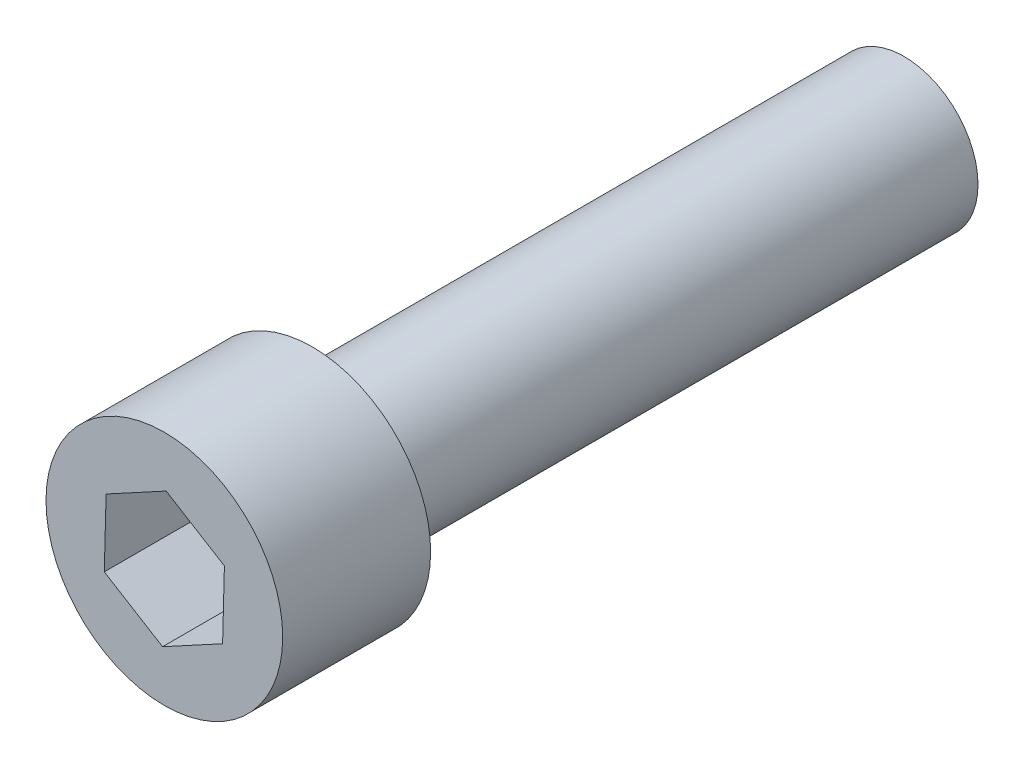
ISO-10303-21;
HEADER;
FILE_DESCRIPTION(('STEP AP214'),'2;1');
FILE_NAME('part.step','',(''),(''),'','','');
FILE_SCHEMA(('AUTOMOTIVE_DESIGN { 1 0 10303 214 1 1 1 1 }'));
ENDSEC;
DATA;
#1=APPLICATION_CONTEXT('core data for automotive mechanical design processes');
#2=APPLICATION_PROTOCOL_DEFINITION('international standard','automotive_design',2000,#1);
#3=PRODUCT_CONTEXT('',#1,'mechanical');
#4=PRODUCT('Part','Part','',(#3));
#5=PRODUCT_RELATED_PRODUCT_CATEGORY('part','',(#4));
#6=PRODUCT_DEFINITION_FORMATION('','',#4);
#7=PRODUCT_DEFINITION_CONTEXT('part definition',#1,'design');
#8=PRODUCT_DEFINITION('design','',#6,#7);
#9=PRODUCT_DEFINITION_SHAPE('','',#8);
#10=(LENGTH_UNIT() NAMED_UNIT(*) SI_UNIT(.MILLI.,.METRE.));
#11=(NAMED_UNIT(*) PLANE_ANGLE_UNIT() SI_UNIT($,.RADIAN.));
#12=(NAMED_UNIT(*) SI_UNIT($,.STERADIAN.) SOLID_ANGLE_UNIT());
#13=UNCERTAINTY_MEASURE_WITH_UNIT(LENGTH_MEASURE(1.E-05),#10,'distance_accuracy_value','');
#14=(GEOMETRIC_REPRESENTATION_CONTEXT(3) GLOBAL_UNCERTAINTY_ASSIGNED_CONTEXT((#13)) GLOBAL_UNIT_ASSIGNED_CONTEXT((#10,
#11,#12)) REPRESENTATION_CONTEXT('',''));
#15=CARTESIAN_POINT('',(0.,0.,0.));
#16=DIRECTION('',(0.,0.,1.));
#17=DIRECTION('',(1.,0.,0.));
#18=AXIS2_PLACEMENT_3D('',#15,#16,#17);
#19=CARTESIAN_POINT('',(0.,0.,20.));
#20=DIRECTION('',(0.,0.,-1.));
#21=DIRECTION('',(-1.,0.,0.));
#22=AXIS2_PLACEMENT_3D('',#19,#20,#21);
#23=CYLINDRICAL_SURFACE('',#22,2.5);
#24=CARTESIAN_POINT('',(0.,0.,20.));
#25=DIRECTION('',(0.,0.,1.));
#26=DIRECTION('',(1.,0.,0.));
#27=AXIS2_PLACEMENT_3D('',#24,#25,#26);
#28=CIRCLE('',#27,2.5);
#29=CARTESIAN_POINT('',(2.5,0.,20.));
#30=VERTEX_POINT('',#29);
#31=EDGE_CURVE('E11',#30,#30,#28,.T.);
#32=ORIENTED_EDGE('',*,*,#31,.F.);
#33=EDGE_LOOP('',(#32));
#34=FACE_BOUND('',#33,.T.);
#35=CARTESIAN_POINT('',(0.,0.,0.));
#36=DIRECTION('',(0.,0.,1.));
#37=DIRECTION('',(1.,0.,0.));
#38=AXIS2_PLACEMENT_3D('',#35,#36,#37);
#39=CIRCLE('',#38,2.5);
#40=CARTESIAN_POINT('',(2.5,0.,0.));
#41=VERTEX_POINT('',#40);
#42=EDGE_CURVE('E42',#41,#41,#39,.T.);
#43=ORIENTED_EDGE('',*,*,#42,.T.);
#44=EDGE_LOOP('',(#43));
#45=FACE_BOUND('',#44,.T.);
#46=ADVANCED_FACE('F39',(#34,#45),#23,.T.);
#47=CARTESIAN_POINT('',(0.,0.,0.));
#48=DIRECTION('',(0.,0.,1.));
#49=DIRECTION('',(1.,0.,0.));
#50=AXIS2_PLACEMENT_3D('',#47,#48,#49);
#51=PLANE('',#50);
#52=ORIENTED_EDGE('',*,*,#42,.F.);
#53=EDGE_LOOP('',(#52));
#54=FACE_BOUND('',#53,.T.);
#55=ADVANCED_FACE('F189',(#54),#51,.F.);
#56=CARTESIAN_POINT('',(0.,0.,25.));
#57=DIRECTION('',(0.,0.,-1.));
#58=DIRECTION('',(-1.,0.,0.));
#59=AXIS2_PLACEMENT_3D('',#56,#57,#58);
#60=CYLINDRICAL_SURFACE('',#59,4.);
#61=CARTESIAN_POINT('',(0.,0.,25.));
#62=DIRECTION('',(0.,0.,1.));
#63=DIRECTION('',(1.,0.,0.));
#64=AXIS2_PLACEMENT_3D('',#61,#62,#63);
#65=CIRCLE('',#64,4.);
#66=CARTESIAN_POINT('',(4.,0.,25.));
#67=VERTEX_POINT('',#66);
#68=EDGE_CURVE('E163',#67,#67,#65,.T.);
#69=ORIENTED_EDGE('',*,*,#68,.F.);
#70=EDGE_LOOP('',(#69));
#71=FACE_BOUND('',#70,.T.);
#72=CARTESIAN_POINT('',(0.,0.,20.));
#73=DIRECTION('',(0.,0.,1.));
#74=DIRECTION('',(1.,0.,0.));
#75=AXIS2_PLACEMENT_3D('',#72,#73,#74);
#76=CIRCLE('',#75,4.);
#77=CARTESIAN_POINT('',(4.,0.,20.));
#78=VERTEX_POINT('',#77);
#79=EDGE_CURVE('E153',#78,#78,#76,.T.);
#80=ORIENTED_EDGE('',*,*,#79,.T.);
#81=EDGE_LOOP('',(#80));
#82=FACE_BOUND('',#81,.T.);
#83=ADVANCED_FACE('F171',(#71,#82),#60,.T.);
#84=CARTESIAN_POINT('',(0.,0.,25.));
#85=DIRECTION('',(0.,0.,1.));
#86=DIRECTION('',(1.,0.,0.));
#87=AXIS2_PLACEMENT_3D('',#84,#85,#86);
#88=PLANE('',#87);
#89=DIRECTION('',(0.878882348655737,0.477038590914169,0.));
#90=VECTOR('',#89,1.);
#91=CARTESIAN_POINT('',(-0.0607687393364618,-2.30860141506774,25.));
#92=LINE('',#91,#90);
#93=CARTESIAN_POINT('',(-0.0607687393364618,-2.30860141506774,25.));
#94=VERTEX_POINT('',#93);
#95=CARTESIAN_POINT('',(1.96892310299314,-1.2069279795552,25.));
#96=VERTEX_POINT('',#95);
#97=EDGE_CURVE('E54',#94,#96,#92,.T.);
#98=ORIENTED_EDGE('',*,*,#97,.F.);
#99=DIRECTION('',(0.852568712645072,-0.522615145416515,0.));
#100=VECTOR('',#99,1.);
#101=CARTESIAN_POINT('',(-2.0296918423296,-1.10167343551254,25.));
#102=LINE('',#101,#100);
#103=CARTESIAN_POINT('',(-2.0296918423296,-1.10167343551254,25.));
#104=VERTEX_POINT('',#103);
#105=EDGE_CURVE('E147',#104,#94,#102,.T.);
#106=ORIENTED_EDGE('',*,*,#105,.F.);
#107=DIRECTION('',(-0.0263136360106654,-0.999653736330685,0.));
#108=VECTOR('',#107,1.);
#109=CARTESIAN_POINT('',(-1.96892310299314,1.2069279795552,25.));
#110=LINE('',#109,#108);
#111=CARTESIAN_POINT('',(-1.96892310299314,1.2069279795552,25.));
#112=VERTEX_POINT('',#111);
#113=EDGE_CURVE('E144',#112,#104,#110,.T.);
#114=ORIENTED_EDGE('',*,*,#113,.F.);
#115=DIRECTION('',(-0.878882348655737,-0.477038590914169,0.));
#116=VECTOR('',#115,1.);
#117=CARTESIAN_POINT('',(0.0607687393364624,2.30860141506775,25.));
#118=LINE('',#117,#116);
#119=CARTESIAN_POINT('',(0.0607687393364624,2.30860141506775,25.));
#120=VERTEX_POINT('',#119);
#121=EDGE_CURVE('E102',#120,#112,#118,.T.);
#122=ORIENTED_EDGE('',*,*,#121,.F.);
#123=DIRECTION('',(-0.852568712645071,0.522615145416516,0.));
#124=VECTOR('',#123,1.);
#125=CARTESIAN_POINT('',(2.0296918423296,1.10167343551254,25.));
#126=LINE('',#125,#124);
#127=CARTESIAN_POINT('',(2.0296918423296,1.10167343551254,25.));
#128=VERTEX_POINT('',#127);
#129=EDGE_CURVE('E138',#128,#120,#126,.T.);
#130=ORIENTED_EDGE('',*,*,#129,.F.);
#131=DIRECTION('',(0.0263136360106652,0.999653736330685,0.));
#132=VECTOR('',#131,1.);
#133=CARTESIAN_POINT('',(1.96892310299314,-1.2069279795552,25.));
#134=LINE('',#133,#132);
#135=EDGE_CURVE('E134',#96,#128,#134,.T.);
#136=ORIENTED_EDGE('',*,*,#135,.F.);
#137=EDGE_LOOP('',(#98,#106,#114,#122,#130,#136));
#138=FACE_BOUND('',#137,.T.);
#139=ORIENTED_EDGE('',*,*,#68,.T.);
#140=EDGE_LOOP('',(#139));
#141=FACE_BOUND('',#140,.T.);
#142=ADVANCED_FACE('F176',(#138,#141),#88,.T.);
#143=CARTESIAN_POINT('',(0.,0.,20.));
#144=DIRECTION('',(0.,0.,1.));
#145=DIRECTION('',(1.,0.,0.));
#146=AXIS2_PLACEMENT_3D('',#143,#144,#145);
#147=PLANE('',#146);
#148=ORIENTED_EDGE('',*,*,#31,.T.);
#149=EDGE_LOOP('',(#148));
#150=FACE_BOUND('',#149,.T.);
#151=ORIENTED_EDGE('',*,*,#79,.F.);
#152=EDGE_LOOP('',(#151));
#153=FACE_BOUND('',#152,.T.);
#154=ADVANCED_FACE('F173',(#150,#153),#147,.F.);
#155=CARTESIAN_POINT('',(-0.0607687393364618,-2.30860141506774,20.));
#156=DIRECTION('',(0.477038590914169,-0.878882348655737,0.));
#157=DIRECTION('',(0.878882348655737,0.477038590914169,0.));
#158=AXIS2_PLACEMENT_3D('',#155,#156,#157);
#159=PLANE('',#158);
#160=ORIENTED_EDGE('',*,*,#97,.T.);
#161=DIRECTION('',(0.,0.,1.));
#162=VECTOR('',#161,1.);
#163=CARTESIAN_POINT('',(1.96892310299314,-1.2069279795552,20.));
#164=LINE('',#163,#162);
#165=CARTESIAN_POINT('',(1.96892310299314,-1.2069279795552,20.));
#166=VERTEX_POINT('',#165);
#167=EDGE_CURVE('E84',#166,#96,#164,.T.);
#168=ORIENTED_EDGE('',*,*,#167,.F.);
#169=DIRECTION('',(0.878882348655737,0.477038590914169,0.));
#170=VECTOR('',#169,1.);
#171=CARTESIAN_POINT('',(-0.0607687393364618,-2.30860141506774,20.));
#172=LINE('',#171,#170);
#173=CARTESIAN_POINT('',(-0.0607687393364618,-2.30860141506774,20.));
#174=VERTEX_POINT('',#173);
#175=EDGE_CURVE('E150',#174,#166,#172,.T.);
#176=ORIENTED_EDGE('',*,*,#175,.F.);
#177=DIRECTION('',(0.,0.,1.));
#178=VECTOR('',#177,1.);
#179=CARTESIAN_POINT('',(-0.0607687393364618,-2.30860141506774,20.));
#180=LINE('',#179,#178);
#181=EDGE_CURVE('E62',#174,#94,#180,.T.);
#182=ORIENTED_EDGE('',*,*,#181,.T.);
#183=EDGE_LOOP('',(#160,#168,#176,#182));
#184=FACE_BOUND('',#183,.T.);
#185=ADVANCED_FACE('F175',(#184),#159,.F.);
#186=CARTESIAN_POINT('',(-2.0296918423296,-1.10167343551254,20.));
#187=DIRECTION('',(-0.522615145416515,-0.852568712645072,0.));
#188=DIRECTION('',(0.852568712645072,-0.522615145416515,0.));
#189=AXIS2_PLACEMENT_3D('',#186,#187,#188);
#190=PLANE('',#189);
#191=ORIENTED_EDGE('',*,*,#105,.T.);
#192=ORIENTED_EDGE('',*,*,#181,.F.);
#193=DIRECTION('',(0.852568712645072,-0.522615145416515,0.));
#194=VECTOR('',#193,1.);
#195=CARTESIAN_POINT('',(-2.0296918423296,-1.10167343551254,20.));
#196=LINE('',#195,#194);
#197=CARTESIAN_POINT('',(-2.0296918423296,-1.10167343551254,20.));
#198=VERTEX_POINT('',#197);
#199=EDGE_CURVE('E116',#198,#174,#196,.T.);
#200=ORIENTED_EDGE('',*,*,#199,.F.);
#201=DIRECTION('',(0.,0.,1.));
#202=VECTOR('',#201,1.);
#203=CARTESIAN_POINT('',(-2.0296918423296,-1.10167343551254,20.));
#204=LINE('',#203,#202);
#205=EDGE_CURVE('E107',#198,#104,#204,.T.);
#206=ORIENTED_EDGE('',*,*,#205,.T.);
#207=EDGE_LOOP('',(#191,#192,#200,#206));
#208=FACE_BOUND('',#207,.T.);
#209=ADVANCED_FACE('F183',(#208),#190,.F.);
#210=CARTESIAN_POINT('',(-1.96892310299314,1.2069279795552,20.));
#211=DIRECTION('',(-0.999653736330685,0.0263136360106654,0.));
#212=DIRECTION('',(-0.0263136360106654,-0.999653736330685,0.));
#213=AXIS2_PLACEMENT_3D('',#210,#211,#212);
#214=PLANE('',#213);
#215=ORIENTED_EDGE('',*,*,#113,.T.);
#216=ORIENTED_EDGE('',*,*,#205,.F.);
#217=DIRECTION('',(-0.0263136360106654,-0.999653736330685,0.));
#218=VECTOR('',#217,1.);
#219=CARTESIAN_POINT('',(-1.96892310299314,1.2069279795552,20.));
#220=LINE('',#219,#218);
#221=CARTESIAN_POINT('',(-1.96892310299314,1.2069279795552,20.));
#222=VERTEX_POINT('',#221);
#223=EDGE_CURVE('E111',#222,#198,#220,.T.);
#224=ORIENTED_EDGE('',*,*,#223,.F.);
#225=DIRECTION('',(0.,0.,1.));
#226=VECTOR('',#225,1.);
#227=CARTESIAN_POINT('',(-1.96892310299314,1.2069279795552,20.));
#228=LINE('',#227,#226);
#229=EDGE_CURVE('E95',#222,#112,#228,.T.);
#230=ORIENTED_EDGE('',*,*,#229,.T.);
#231=EDGE_LOOP('',(#215,#216,#224,#230));
#232=FACE_BOUND('',#231,.T.);
#233=ADVANCED_FACE('F112',(#232),#214,.F.);
#234=CARTESIAN_POINT('',(0.0607687393364624,2.30860141506775,20.));
#235=DIRECTION('',(-0.477038590914169,0.878882348655737,0.));
#236=DIRECTION('',(-0.878882348655737,-0.477038590914169,0.));
#237=AXIS2_PLACEMENT_3D('',#234,#235,#236);
#238=PLANE('',#237);
#239=ORIENTED_EDGE('',*,*,#121,.T.);
#240=ORIENTED_EDGE('',*,*,#229,.F.);
#241=DIRECTION('',(-0.878882348655737,-0.477038590914169,0.));
#242=VECTOR('',#241,1.);
#243=CARTESIAN_POINT('',(0.0607687393364624,2.30860141506775,20.));
#244=LINE('',#243,#242);
#245=CARTESIAN_POINT('',(0.0607687393364624,2.30860141506775,20.));
#246=VERTEX_POINT('',#245);
#247=EDGE_CURVE('E99',#246,#222,#244,.T.);
#248=ORIENTED_EDGE('',*,*,#247,.F.);
#249=DIRECTION('',(0.,0.,1.));
#250=VECTOR('',#249,1.);
#251=CARTESIAN_POINT('',(0.0607687393364624,2.30860141506775,20.));
#252=LINE('',#251,#250);
#253=EDGE_CURVE('E108',#246,#120,#252,.T.);
#254=ORIENTED_EDGE('',*,*,#253,.T.);
#255=EDGE_LOOP('',(#239,#240,#248,#254));
#256=FACE_BOUND('',#255,.T.);
#257=ADVANCED_FACE('F97',(#256),#238,.F.);
#258=CARTESIAN_POINT('',(2.0296918423296,1.10167343551254,20.));
#259=DIRECTION('',(0.522615145416516,0.852568712645071,0.));
#260=DIRECTION('',(-0.852568712645071,0.522615145416516,0.));
#261=AXIS2_PLACEMENT_3D('',#258,#259,#260);
#262=PLANE('',#261);
#263=ORIENTED_EDGE('',*,*,#129,.T.);
#264=ORIENTED_EDGE('',*,*,#253,.F.);
#265=DIRECTION('',(-0.852568712645071,0.522615145416516,0.));
#266=VECTOR('',#265,1.);
#267=CARTESIAN_POINT('',(2.0296918423296,1.10167343551254,20.));
#268=LINE('',#267,#266);
#269=CARTESIAN_POINT('',(2.0296918423296,1.10167343551254,20.));
#270=VERTEX_POINT('',#269);
#271=EDGE_CURVE('E122',#270,#246,#268,.T.);
#272=ORIENTED_EDGE('',*,*,#271,.F.);
#273=DIRECTION('',(0.,0.,1.));
#274=VECTOR('',#273,1.);
#275=CARTESIAN_POINT('',(2.0296918423296,1.10167343551254,20.));
#276=LINE('',#275,#274);
#277=EDGE_CURVE('E158',#270,#128,#276,.T.);
#278=ORIENTED_EDGE('',*,*,#277,.T.);
#279=EDGE_LOOP('',(#263,#264,#272,#278));
#280=FACE_BOUND('',#279,.T.);
#281=ADVANCED_FACE('F245',(#280),#262,.F.);
#282=CARTESIAN_POINT('',(1.96892310299314,-1.2069279795552,20.));
#283=DIRECTION('',(0.999653736330685,-0.0263136360106652,0.));
#284=DIRECTION('',(0.0263136360106652,0.999653736330685,0.));
#285=AXIS2_PLACEMENT_3D('',#282,#283,#284);
#286=PLANE('',#285);
#287=ORIENTED_EDGE('',*,*,#135,.T.);
#288=ORIENTED_EDGE('',*,*,#277,.F.);
#289=DIRECTION('',(0.0263136360106652,0.999653736330685,0.));
#290=VECTOR('',#289,1.);
#291=CARTESIAN_POINT('',(1.96892310299314,-1.2069279795552,20.));
#292=LINE('',#291,#290);
#293=EDGE_CURVE('E126',#166,#270,#292,.T.);
#294=ORIENTED_EDGE('',*,*,#293,.F.);
#295=ORIENTED_EDGE('',*,*,#167,.T.);
#296=EDGE_LOOP('',(#287,#288,#294,#295));
#297=FACE_BOUND('',#296,.T.);
#298=ADVANCED_FACE('F254',(#297),#286,.F.);
#299=CARTESIAN_POINT('',(0.,0.,20.));
#300=DIRECTION('',(0.,0.,1.));
#301=DIRECTION('',(1.,0.,0.));
#302=AXIS2_PLACEMENT_3D('',#299,#300,#301);
#303=PLANE('',#302);
#304=ORIENTED_EDGE('',*,*,#175,.T.);
#305=ORIENTED_EDGE('',*,*,#293,.T.);
#306=ORIENTED_EDGE('',*,*,#271,.T.);
#307=ORIENTED_EDGE('',*,*,#247,.T.);
#308=ORIENTED_EDGE('',*,*,#223,.T.);
#309=ORIENTED_EDGE('',*,*,#199,.T.);
#310=EDGE_LOOP('',(#304,#305,#306,#307,#308,#309));
#311=FACE_BOUND('',#310,.T.);
#312=ADVANCED_FACE('F119',(#311),#303,.T.);
#313=CLOSED_SHELL('',(#46,#55,#83,#142,#154,#185,#209,#233,#257,#281,#298,#312));
#314=MANIFOLD_SOLID_BREP('B2',#313);
#315=ADVANCED_BREP_SHAPE_REPRESENTATION('',(#18,#314),#14);
#316=SHAPE_DEFINITION_REPRESENTATION(#9,#315);
ENDSEC;
END-ISO-10303-21;
